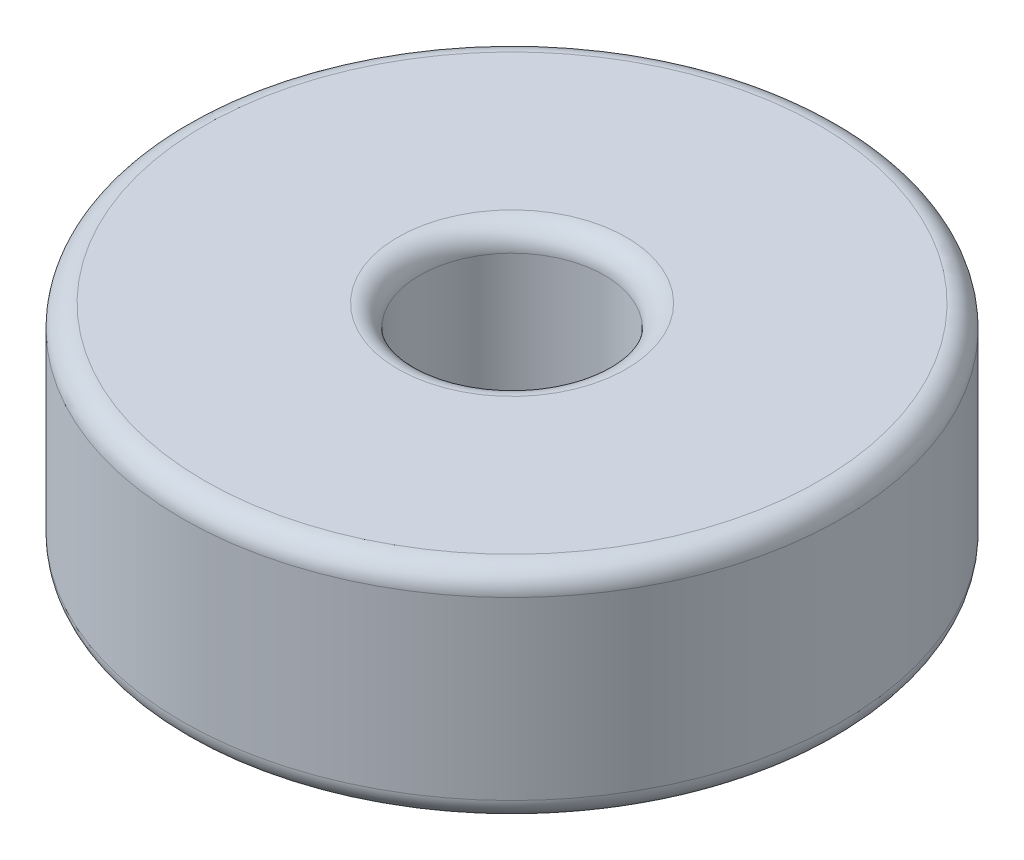
ISO-10303-21;
HEADER;
FILE_DESCRIPTION(('STEP AP214'),'2;1');
FILE_NAME('part.step','',(''),(''),'','','');
FILE_SCHEMA(('AUTOMOTIVE_DESIGN { 1 0 10303 214 1 1 1 1 }'));
ENDSEC;
DATA;
#1=APPLICATION_CONTEXT('core data for automotive mechanical design processes');
#2=APPLICATION_PROTOCOL_DEFINITION('international standard','automotive_design',2000,#1);
#3=PRODUCT_CONTEXT('',#1,'mechanical');
#4=PRODUCT('Part','Part','',(#3));
#5=PRODUCT_RELATED_PRODUCT_CATEGORY('part','',(#4));
#6=PRODUCT_DEFINITION_FORMATION('','',#4);
#7=PRODUCT_DEFINITION_CONTEXT('part definition',#1,'design');
#8=PRODUCT_DEFINITION('design','',#6,#7);
#9=PRODUCT_DEFINITION_SHAPE('','',#8);
#10=(LENGTH_UNIT() NAMED_UNIT(*) SI_UNIT(.MILLI.,.METRE.));
#11=(NAMED_UNIT(*) PLANE_ANGLE_UNIT() SI_UNIT($,.RADIAN.));
#12=(NAMED_UNIT(*) SI_UNIT($,.STERADIAN.) SOLID_ANGLE_UNIT());
#13=UNCERTAINTY_MEASURE_WITH_UNIT(LENGTH_MEASURE(1.E-05),#10,'distance_accuracy_value','');
#14=(GEOMETRIC_REPRESENTATION_CONTEXT(3) GLOBAL_UNCERTAINTY_ASSIGNED_CONTEXT((#13)) GLOBAL_UNIT_ASSIGNED_CONTEXT((#10,
#11,#12)) REPRESENTATION_CONTEXT('',''));
#15=CARTESIAN_POINT('',(0.,0.,0.));
#16=DIRECTION('',(0.,0.,1.));
#17=DIRECTION('',(1.,0.,0.));
#18=AXIS2_PLACEMENT_3D('',#15,#16,#17);
#19=CARTESIAN_POINT('',(0.,5.,0.));
#20=DIRECTION('',(0.,1.,0.));
#21=DIRECTION('',(0.,0.,1.));
#22=AXIS2_PLACEMENT_3D('',#19,#20,#21);
#23=PLANE('',#22);
#24=CARTESIAN_POINT('',(0.,5.,0.));
#25=DIRECTION('',(0.,1.,0.));
#26=DIRECTION('',(0.,0.,1.));
#27=AXIS2_PLACEMENT_3D('',#24,#25,#26);
#28=CIRCLE('',#27,2.6);
#29=CARTESIAN_POINT('',(0.,5.,2.6));
#30=VERTEX_POINT('',#29);
#31=EDGE_CURVE('E42',#30,#30,#28,.F.);
#32=ORIENTED_EDGE('',*,*,#31,.T.);
#33=EDGE_LOOP('',(#32));
#34=FACE_BOUND('',#33,.T.);
#35=CARTESIAN_POINT('',(0.,5.,0.));
#36=DIRECTION('',(0.,1.,0.));
#37=DIRECTION('',(0.,0.,1.));
#38=AXIS2_PLACEMENT_3D('',#35,#36,#37);
#39=CIRCLE('',#38,7.);
#40=CARTESIAN_POINT('',(0.,5.,7.));
#41=VERTEX_POINT('',#40);
#42=EDGE_CURVE('E46',#41,#41,#39,.T.);
#43=ORIENTED_EDGE('',*,*,#42,.T.);
#44=EDGE_LOOP('',(#43));
#45=FACE_BOUND('',#44,.T.);
#46=ADVANCED_FACE('F31',(#34,#45),#23,.T.);
#47=CARTESIAN_POINT('',(0.,0.,0.));
#48=DIRECTION('',(0.,1.,0.));
#49=DIRECTION('',(0.,0.,1.));
#50=AXIS2_PLACEMENT_3D('',#47,#48,#49);
#51=PLANE('',#50);
#52=CARTESIAN_POINT('',(0.,0.,0.));
#53=DIRECTION('',(0.,1.,0.));
#54=DIRECTION('',(0.,0.,1.));
#55=AXIS2_PLACEMENT_3D('',#52,#53,#54);
#56=CIRCLE('',#55,2.6);
#57=CARTESIAN_POINT('',(0.,0.,2.6));
#58=VERTEX_POINT('',#57);
#59=EDGE_CURVE('E57',#58,#58,#56,.T.);
#60=ORIENTED_EDGE('',*,*,#59,.T.);
#61=EDGE_LOOP('',(#60));
#62=FACE_BOUND('',#61,.T.);
#63=CARTESIAN_POINT('',(0.,0.,0.));
#64=DIRECTION('',(0.,1.,0.));
#65=DIRECTION('',(0.,0.,1.));
#66=AXIS2_PLACEMENT_3D('',#63,#64,#65);
#67=CIRCLE('',#66,7.);
#68=CARTESIAN_POINT('',(0.,0.,7.));
#69=VERTEX_POINT('',#68);
#70=EDGE_CURVE('E60',#69,#69,#67,.F.);
#71=ORIENTED_EDGE('',*,*,#70,.T.);
#72=EDGE_LOOP('',(#71));
#73=FACE_BOUND('',#72,.T.);
#74=ADVANCED_FACE('F64',(#62,#73),#51,.F.);
#75=CARTESIAN_POINT('',(0.,5.,0.));
#76=DIRECTION('',(0.,-1.,0.));
#77=DIRECTION('',(0.,0.,-1.));
#78=AXIS2_PLACEMENT_3D('',#75,#76,#77);
#79=CYLINDRICAL_SURFACE('',#78,7.5);
#80=CARTESIAN_POINT('',(0.,0.5,0.));
#81=DIRECTION('',(0.,1.,0.));
#82=DIRECTION('',(0.,0.,1.));
#83=AXIS2_PLACEMENT_3D('',#80,#81,#82);
#84=CIRCLE('',#83,7.5);
#85=CARTESIAN_POINT('',(0.,0.5,7.5));
#86=VERTEX_POINT('',#85);
#87=EDGE_CURVE('E10',#86,#86,#84,.T.);
#88=ORIENTED_EDGE('',*,*,#87,.T.);
#89=EDGE_LOOP('',(#88));
#90=FACE_BOUND('',#89,.T.);
#91=CARTESIAN_POINT('',(0.,4.5,0.));
#92=DIRECTION('',(0.,1.,0.));
#93=DIRECTION('',(0.,0.,1.));
#94=AXIS2_PLACEMENT_3D('',#91,#92,#93);
#95=CIRCLE('',#94,7.5);
#96=CARTESIAN_POINT('',(0.,4.5,7.5));
#97=VERTEX_POINT('',#96);
#98=EDGE_CURVE('E38',#97,#97,#95,.F.);
#99=ORIENTED_EDGE('',*,*,#98,.T.);
#100=EDGE_LOOP('',(#99));
#101=FACE_BOUND('',#100,.T.);
#102=ADVANCED_FACE('F84',(#90,#101),#79,.T.);
#103=CARTESIAN_POINT('',(0.,5.,0.));
#104=DIRECTION('',(0.,-1.,0.));
#105=DIRECTION('',(0.,0.,-1.));
#106=AXIS2_PLACEMENT_3D('',#103,#104,#105);
#107=CYLINDRICAL_SURFACE('',#106,2.1);
#108=CARTESIAN_POINT('',(0.,0.5,0.));
#109=DIRECTION('',(0.,1.,0.));
#110=DIRECTION('',(0.,0.,1.));
#111=AXIS2_PLACEMENT_3D('',#108,#109,#110);
#112=CIRCLE('',#111,2.1);
#113=CARTESIAN_POINT('',(0.,0.5,2.1));
#114=VERTEX_POINT('',#113);
#115=EDGE_CURVE('E51',#114,#114,#112,.F.);
#116=ORIENTED_EDGE('',*,*,#115,.T.);
#117=EDGE_LOOP('',(#116));
#118=FACE_BOUND('',#117,.T.);
#119=CARTESIAN_POINT('',(0.,4.5,0.));
#120=DIRECTION('',(0.,1.,0.));
#121=DIRECTION('',(0.,0.,1.));
#122=AXIS2_PLACEMENT_3D('',#119,#120,#121);
#123=CIRCLE('',#122,2.1);
#124=CARTESIAN_POINT('',(0.,4.5,2.1));
#125=VERTEX_POINT('',#124);
#126=EDGE_CURVE('E54',#125,#125,#123,.T.);
#127=ORIENTED_EDGE('',*,*,#126,.T.);
#128=EDGE_LOOP('',(#127));
#129=FACE_BOUND('',#128,.T.);
#130=ADVANCED_FACE('F89',(#118,#129),#107,.F.);
#131=CARTESIAN_POINT('',(0.,0.5,0.));
#132=DIRECTION('',(0.,1.,0.));
#133=DIRECTION('',(0.,0.,1.));
#134=AXIS2_PLACEMENT_3D('',#131,#132,#133);
#135=TOROIDAL_SURFACE('',#134,2.6,0.5);
#136=ORIENTED_EDGE('',*,*,#115,.F.);
#137=EDGE_LOOP('',(#136));
#138=FACE_BOUND('',#137,.T.);
#139=ORIENTED_EDGE('',*,*,#59,.F.);
#140=EDGE_LOOP('',(#139));
#141=FACE_BOUND('',#140,.T.);
#142=ADVANCED_FACE('F75',(#138,#141),#135,.T.);
#143=CARTESIAN_POINT('',(0.,4.5,0.));
#144=DIRECTION('',(0.,1.,0.));
#145=DIRECTION('',(0.,0.,1.));
#146=AXIS2_PLACEMENT_3D('',#143,#144,#145);
#147=TOROIDAL_SURFACE('',#146,2.6,0.5);
#148=ORIENTED_EDGE('',*,*,#31,.F.);
#149=EDGE_LOOP('',(#148));
#150=FACE_BOUND('',#149,.T.);
#151=ORIENTED_EDGE('',*,*,#126,.F.);
#152=EDGE_LOOP('',(#151));
#153=FACE_BOUND('',#152,.T.);
#154=ADVANCED_FACE('F69',(#150,#153),#147,.T.);
#155=CARTESIAN_POINT('',(0.,0.5,0.));
#156=DIRECTION('',(0.,1.,0.));
#157=DIRECTION('',(0.,0.,1.));
#158=AXIS2_PLACEMENT_3D('',#155,#156,#157);
#159=TOROIDAL_SURFACE('',#158,7.,0.5);
#160=ORIENTED_EDGE('',*,*,#70,.F.);
#161=EDGE_LOOP('',(#160));
#162=FACE_BOUND('',#161,.T.);
#163=ORIENTED_EDGE('',*,*,#87,.F.);
#164=EDGE_LOOP('',(#163));
#165=FACE_BOUND('',#164,.T.);
#166=ADVANCED_FACE('F66',(#162,#165),#159,.T.);
#167=CARTESIAN_POINT('',(0.,4.5,0.));
#168=DIRECTION('',(0.,1.,0.));
#169=DIRECTION('',(0.,0.,1.));
#170=AXIS2_PLACEMENT_3D('',#167,#168,#169);
#171=TOROIDAL_SURFACE('',#170,7.,0.5);
#172=ORIENTED_EDGE('',*,*,#98,.F.);
#173=EDGE_LOOP('',(#172));
#174=FACE_BOUND('',#173,.T.);
#175=ORIENTED_EDGE('',*,*,#42,.F.);
#176=EDGE_LOOP('',(#175));
#177=FACE_BOUND('',#176,.T.);
#178=ADVANCED_FACE('F33',(#174,#177),#171,.T.);
#179=CLOSED_SHELL('',(#46,#74,#102,#130,#142,#154,#166,#178));
#180=MANIFOLD_SOLID_BREP('B2',#179);
#181=ADVANCED_BREP_SHAPE_REPRESENTATION('',(#18,#180),#14);
#182=SHAPE_DEFINITION_REPRESENTATION(#9,#181);
ENDSEC;
END-ISO-10303-21;
